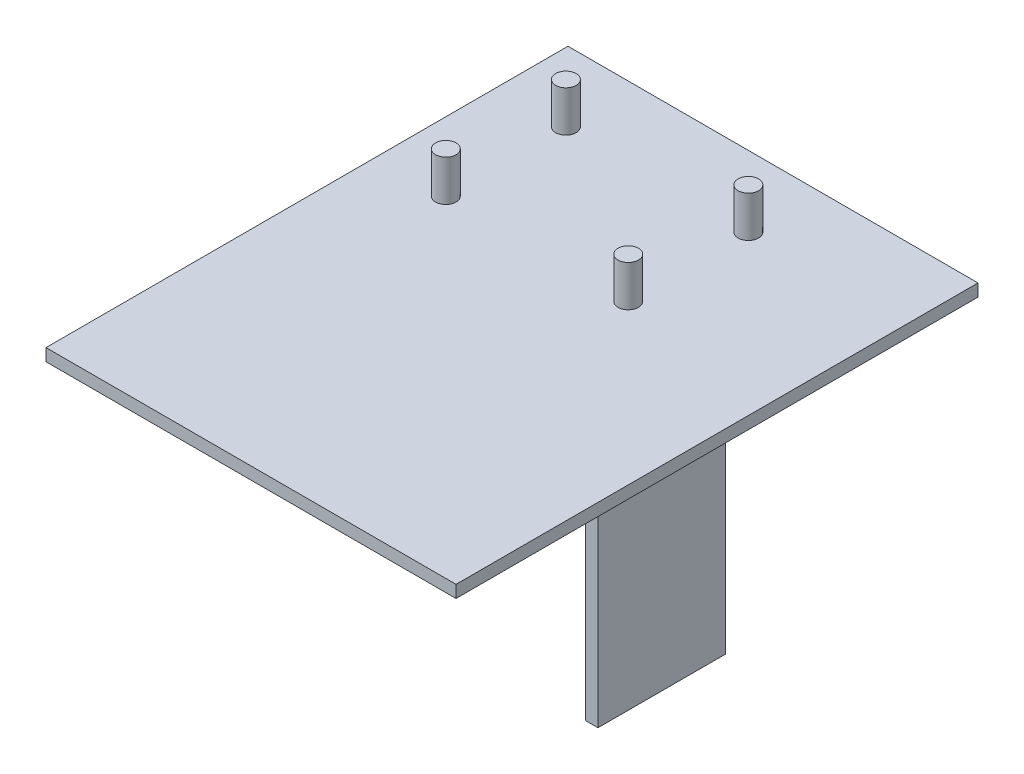
ISO-10303-21;
HEADER;
FILE_DESCRIPTION(('STEP AP214'),'2;1');
FILE_NAME('part.step','',(''),(''),'','','');
FILE_SCHEMA(('AUTOMOTIVE_DESIGN { 1 0 10303 214 1 1 1 1 }'));
ENDSEC;
DATA;
#1=APPLICATION_CONTEXT('core data for automotive mechanical design processes');
#2=APPLICATION_PROTOCOL_DEFINITION('international standard','automotive_design',2000,#1);
#3=PRODUCT_CONTEXT('',#1,'mechanical');
#4=PRODUCT('Part','Part','',(#3));
#5=PRODUCT_RELATED_PRODUCT_CATEGORY('part','',(#4));
#6=PRODUCT_DEFINITION_FORMATION('','',#4);
#7=PRODUCT_DEFINITION_CONTEXT('part definition',#1,'design');
#8=PRODUCT_DEFINITION('design','',#6,#7);
#9=PRODUCT_DEFINITION_SHAPE('','',#8);
#10=(LENGTH_UNIT() NAMED_UNIT(*) SI_UNIT(.MILLI.,.METRE.));
#11=(NAMED_UNIT(*) PLANE_ANGLE_UNIT() SI_UNIT($,.RADIAN.));
#12=(NAMED_UNIT(*) SI_UNIT($,.STERADIAN.) SOLID_ANGLE_UNIT());
#13=UNCERTAINTY_MEASURE_WITH_UNIT(LENGTH_MEASURE(1.E-05),#10,'distance_accuracy_value','');
#14=(GEOMETRIC_REPRESENTATION_CONTEXT(3) GLOBAL_UNCERTAINTY_ASSIGNED_CONTEXT((#13)) GLOBAL_UNIT_ASSIGNED_CONTEXT((#10,
#11,#12)) REPRESENTATION_CONTEXT('',''));
#15=CARTESIAN_POINT('',(0.,0.,0.));
#16=DIRECTION('',(0.,0.,1.));
#17=DIRECTION('',(1.,0.,0.));
#18=AXIS2_PLACEMENT_3D('',#15,#16,#17);
#19=CARTESIAN_POINT('',(0.,3.,0.));
#20=DIRECTION('',(0.,1.,0.));
#21=DIRECTION('',(0.,0.,1.));
#22=AXIS2_PLACEMENT_3D('',#19,#20,#21);
#23=PLANE('',#22);
#24=CARTESIAN_POINT('',(-33.2337453192935,3.,-17.0873669438549));
#25=DIRECTION('',(0.,1.,0.));
#26=DIRECTION('',(0.,0.,1.));
#27=AXIS2_PLACEMENT_3D('',#24,#25,#26);
#28=CIRCLE('',#27,2.5);
#29=CARTESIAN_POINT('',(-33.2337453192935,3.,-14.5873669438549));
#30=VERTEX_POINT('',#29);
#31=EDGE_CURVE('E243',#30,#30,#28,.T.);
#32=ORIENTED_EDGE('',*,*,#31,.F.);
#33=EDGE_LOOP('',(#32));
#34=FACE_BOUND('',#33,.T.);
#35=CARTESIAN_POINT('',(11.261315090124,3.,-46.3787356727323));
#36=DIRECTION('',(0.,1.,0.));
#37=DIRECTION('',(0.,0.,1.));
#38=AXIS2_PLACEMENT_3D('',#35,#36,#37);
#39=CIRCLE('',#38,2.5);
#40=CARTESIAN_POINT('',(11.261315090124,3.,-43.8787356727323));
#41=VERTEX_POINT('',#40);
#42=EDGE_CURVE('E258',#41,#41,#39,.T.);
#43=ORIENTED_EDGE('',*,*,#42,.F.);
#44=EDGE_LOOP('',(#43));
#45=FACE_BOUND('',#44,.T.);
#46=DIRECTION('',(0.,0.,-1.));
#47=VECTOR('',#46,1.);
#48=CARTESIAN_POINT('',(50.,3.,-63.6523764971984));
#49=LINE('',#48,#47);
#50=CARTESIAN_POINT('',(50.,3.,63.6523764971983));
#51=VERTEX_POINT('',#50);
#52=CARTESIAN_POINT('',(50.,3.,-63.6523764971984));
#53=VERTEX_POINT('',#52);
#54=EDGE_CURVE('E128',#51,#53,#49,.T.);
#55=ORIENTED_EDGE('',*,*,#54,.T.);
#56=DIRECTION('',(-1.,0.,0.));
#57=VECTOR('',#56,1.);
#58=CARTESIAN_POINT('',(-50.,3.,-63.6523764971984));
#59=LINE('',#58,#57);
#60=CARTESIAN_POINT('',(-50.,3.,-63.6523764971984));
#61=VERTEX_POINT('',#60);
#62=EDGE_CURVE('E131',#53,#61,#59,.T.);
#63=ORIENTED_EDGE('',*,*,#62,.T.);
#64=DIRECTION('',(0.,0.,1.));
#65=VECTOR('',#64,1.);
#66=CARTESIAN_POINT('',(-50.,3.,-63.6523764971984));
#67=LINE('',#66,#65);
#68=CARTESIAN_POINT('',(-50.,3.,63.6523764971983));
#69=VERTEX_POINT('',#68);
#70=EDGE_CURVE('E134',#61,#69,#67,.T.);
#71=ORIENTED_EDGE('',*,*,#70,.T.);
#72=DIRECTION('',(1.,0.,0.));
#73=VECTOR('',#72,1.);
#74=CARTESIAN_POINT('',(-50.,3.,63.6523764971983));
#75=LINE('',#74,#73);
#76=EDGE_CURVE('E136',#69,#51,#75,.T.);
#77=ORIENTED_EDGE('',*,*,#76,.T.);
#78=EDGE_LOOP('',(#55,#63,#71,#77));
#79=FACE_BOUND('',#78,.T.);
#80=CARTESIAN_POINT('',(11.261315090124,3.,-17.0873669438549));
#81=DIRECTION('',(0.,1.,0.));
#82=DIRECTION('',(0.,0.,1.));
#83=AXIS2_PLACEMENT_3D('',#80,#81,#82);
#84=CIRCLE('',#83,2.5);
#85=CARTESIAN_POINT('',(11.261315090124,3.,-14.5873669438549));
#86=VERTEX_POINT('',#85);
#87=EDGE_CURVE('E253',#86,#86,#84,.T.);
#88=ORIENTED_EDGE('',*,*,#87,.F.);
#89=EDGE_LOOP('',(#88));
#90=FACE_BOUND('',#89,.T.);
#91=CARTESIAN_POINT('',(-33.2337453192935,3.,-46.3787356727323));
#92=DIRECTION('',(0.,1.,0.));
#93=DIRECTION('',(0.,0.,1.));
#94=AXIS2_PLACEMENT_3D('',#91,#92,#93);
#95=CIRCLE('',#94,2.5);
#96=CARTESIAN_POINT('',(-33.2337453192935,3.,-43.8787356727323));
#97=VERTEX_POINT('',#96);
#98=EDGE_CURVE('E244',#97,#97,#95,.T.);
#99=ORIENTED_EDGE('',*,*,#98,.F.);
#100=EDGE_LOOP('',(#99));
#101=FACE_BOUND('',#100,.T.);
#102=ADVANCED_FACE('F33',(#34,#45,#79,#90,#101),#23,.T.);
#103=CARTESIAN_POINT('',(0.,0.,0.));
#104=DIRECTION('',(0.,1.,0.));
#105=DIRECTION('',(0.,0.,1.));
#106=AXIS2_PLACEMENT_3D('',#103,#104,#105);
#107=PLANE('',#106);
#108=DIRECTION('',(0.,0.,-1.));
#109=VECTOR('',#108,1.);
#110=CARTESIAN_POINT('',(50.,0.,-63.6523764971984));
#111=LINE('',#110,#109);
#112=CARTESIAN_POINT('',(50.,0.,63.6523764971983));
#113=VERTEX_POINT('',#112);
#114=CARTESIAN_POINT('',(50.,0.,-63.6523764971984));
#115=VERTEX_POINT('',#114);
#116=EDGE_CURVE('E119',#113,#115,#111,.T.);
#117=ORIENTED_EDGE('',*,*,#116,.F.);
#118=DIRECTION('',(1.,0.,0.));
#119=VECTOR('',#118,1.);
#120=CARTESIAN_POINT('',(-50.,0.,63.6523764971983));
#121=LINE('',#120,#119);
#122=CARTESIAN_POINT('',(-50.,0.,63.6523764971983));
#123=VERTEX_POINT('',#122);
#124=EDGE_CURVE('E132',#123,#113,#121,.T.);
#125=ORIENTED_EDGE('',*,*,#124,.F.);
#126=DIRECTION('',(0.,0.,1.));
#127=VECTOR('',#126,1.);
#128=CARTESIAN_POINT('',(-50.,0.,-63.6523764971984));
#129=LINE('',#128,#127);
#130=CARTESIAN_POINT('',(-50.,0.,-63.6523764971984));
#131=VERTEX_POINT('',#130);
#132=EDGE_CURVE('E140',#131,#123,#129,.T.);
#133=ORIENTED_EDGE('',*,*,#132,.F.);
#134=DIRECTION('',(-1.,0.,0.));
#135=VECTOR('',#134,1.);
#136=CARTESIAN_POINT('',(-50.,0.,-63.6523764971984));
#137=LINE('',#136,#135);
#138=EDGE_CURVE('E122',#115,#131,#137,.T.);
#139=ORIENTED_EDGE('',*,*,#138,.F.);
#140=EDGE_LOOP('',(#117,#125,#133,#139));
#141=FACE_BOUND('',#140,.T.);
#142=DIRECTION('',(0.,0.,1.));
#143=VECTOR('',#142,1.);
#144=CARTESIAN_POINT('',(34.6108399779155,0.,13.6473454260511));
#145=LINE('',#144,#143);
#146=CARTESIAN_POINT('',(34.6108399779155,0.,-17.4962251040256));
#147=VERTEX_POINT('',#146);
#148=CARTESIAN_POINT('',(34.6108399779155,0.,13.6473454260511));
#149=VERTEX_POINT('',#148);
#150=EDGE_CURVE('E118',#147,#149,#145,.T.);
#151=ORIENTED_EDGE('',*,*,#150,.F.);
#152=DIRECTION('',(1.,0.,0.));
#153=VECTOR('',#152,1.);
#154=CARTESIAN_POINT('',(34.6108399779155,0.,-17.4962251040256));
#155=LINE('',#154,#153);
#156=CARTESIAN_POINT('',(31.6108399779155,0.,-17.4962251040256));
#157=VERTEX_POINT('',#156);
#158=EDGE_CURVE('E115',#157,#147,#155,.T.);
#159=ORIENTED_EDGE('',*,*,#158,.F.);
#160=DIRECTION('',(0.,0.,-1.));
#161=VECTOR('',#160,1.);
#162=CARTESIAN_POINT('',(31.6108399779155,0.,13.6473454260511));
#163=LINE('',#162,#161);
#164=CARTESIAN_POINT('',(31.6108399779155,0.,13.6473454260511));
#165=VERTEX_POINT('',#164);
#166=EDGE_CURVE('E53',#165,#157,#163,.T.);
#167=ORIENTED_EDGE('',*,*,#166,.F.);
#168=DIRECTION('',(-1.,0.,0.));
#169=VECTOR('',#168,1.);
#170=CARTESIAN_POINT('',(34.6108399779155,0.,13.6473454260511));
#171=LINE('',#170,#169);
#172=EDGE_CURVE('E48',#149,#165,#171,.T.);
#173=ORIENTED_EDGE('',*,*,#172,.F.);
#174=EDGE_LOOP('',(#151,#159,#167,#173));
#175=FACE_BOUND('',#174,.T.);
#176=ADVANCED_FACE('F158',(#141,#175),#107,.F.);
#177=CARTESIAN_POINT('',(50.,3.,-63.6523764971984));
#178=DIRECTION('',(-1.,0.,0.));
#179=DIRECTION('',(0.,0.,1.));
#180=AXIS2_PLACEMENT_3D('',#177,#178,#179);
#181=PLANE('',#180);
#182=ORIENTED_EDGE('',*,*,#116,.T.);
#183=DIRECTION('',(0.,-1.,0.));
#184=VECTOR('',#183,1.);
#185=CARTESIAN_POINT('',(50.,3.,-63.6523764971984));
#186=LINE('',#185,#184);
#187=EDGE_CURVE('E11',#53,#115,#186,.T.);
#188=ORIENTED_EDGE('',*,*,#187,.F.);
#189=ORIENTED_EDGE('',*,*,#54,.F.);
#190=DIRECTION('',(0.,-1.,0.));
#191=VECTOR('',#190,1.);
#192=CARTESIAN_POINT('',(50.,3.,63.6523764971983));
#193=LINE('',#192,#191);
#194=EDGE_CURVE('E137',#51,#113,#193,.T.);
#195=ORIENTED_EDGE('',*,*,#194,.T.);
#196=EDGE_LOOP('',(#182,#188,#189,#195));
#197=FACE_BOUND('',#196,.T.);
#198=ADVANCED_FACE('F35',(#197),#181,.F.);
#199=CARTESIAN_POINT('',(-50.,3.,-63.6523764971984));
#200=DIRECTION('',(0.,0.,1.));
#201=DIRECTION('',(1.,0.,0.));
#202=AXIS2_PLACEMENT_3D('',#199,#200,#201);
#203=PLANE('',#202);
#204=ORIENTED_EDGE('',*,*,#138,.T.);
#205=DIRECTION('',(0.,-1.,0.));
#206=VECTOR('',#205,1.);
#207=CARTESIAN_POINT('',(-50.,3.,-63.6523764971984));
#208=LINE('',#207,#206);
#209=EDGE_CURVE('E41',#61,#131,#208,.T.);
#210=ORIENTED_EDGE('',*,*,#209,.F.);
#211=ORIENTED_EDGE('',*,*,#62,.F.);
#212=ORIENTED_EDGE('',*,*,#187,.T.);
#213=EDGE_LOOP('',(#204,#210,#211,#212));
#214=FACE_BOUND('',#213,.T.);
#215=ADVANCED_FACE('F168',(#214),#203,.F.);
#216=CARTESIAN_POINT('',(-50.,3.,-63.6523764971984));
#217=DIRECTION('',(1.,0.,0.));
#218=DIRECTION('',(0.,0.,-1.));
#219=AXIS2_PLACEMENT_3D('',#216,#217,#218);
#220=PLANE('',#219);
#221=ORIENTED_EDGE('',*,*,#132,.T.);
#222=DIRECTION('',(0.,-1.,0.));
#223=VECTOR('',#222,1.);
#224=CARTESIAN_POINT('',(-50.,3.,63.6523764971983));
#225=LINE('',#224,#223);
#226=EDGE_CURVE('E145',#69,#123,#225,.T.);
#227=ORIENTED_EDGE('',*,*,#226,.F.);
#228=ORIENTED_EDGE('',*,*,#70,.F.);
#229=ORIENTED_EDGE('',*,*,#209,.T.);
#230=EDGE_LOOP('',(#221,#227,#228,#229));
#231=FACE_BOUND('',#230,.T.);
#232=ADVANCED_FACE('F152',(#231),#220,.F.);
#233=CARTESIAN_POINT('',(-50.,3.,63.6523764971983));
#234=DIRECTION('',(0.,0.,-1.));
#235=DIRECTION('',(-1.,0.,0.));
#236=AXIS2_PLACEMENT_3D('',#233,#234,#235);
#237=PLANE('',#236);
#238=ORIENTED_EDGE('',*,*,#124,.T.);
#239=ORIENTED_EDGE('',*,*,#194,.F.);
#240=ORIENTED_EDGE('',*,*,#76,.F.);
#241=ORIENTED_EDGE('',*,*,#226,.T.);
#242=EDGE_LOOP('',(#238,#239,#240,#241));
#243=FACE_BOUND('',#242,.T.);
#244=ADVANCED_FACE('F161',(#243),#237,.F.);
#245=CARTESIAN_POINT('',(34.6108399779155,-60.,13.6473454260511));
#246=DIRECTION('',(-1.,0.,0.));
#247=DIRECTION('',(0.,0.,1.));
#248=AXIS2_PLACEMENT_3D('',#245,#246,#247);
#249=PLANE('',#248);
#250=ORIENTED_EDGE('',*,*,#150,.T.);
#251=DIRECTION('',(0.,1.,0.));
#252=VECTOR('',#251,1.);
#253=CARTESIAN_POINT('',(34.6108399779155,-60.,13.6473454260511));
#254=LINE('',#253,#252);
#255=CARTESIAN_POINT('',(34.6108399779155,-60.,13.6473454260511));
#256=VERTEX_POINT('',#255);
#257=EDGE_CURVE('E99',#256,#149,#254,.T.);
#258=ORIENTED_EDGE('',*,*,#257,.F.);
#259=DIRECTION('',(0.,0.,1.));
#260=VECTOR('',#259,1.);
#261=CARTESIAN_POINT('',(34.6108399779155,-60.,13.6473454260511));
#262=LINE('',#261,#260);
#263=CARTESIAN_POINT('',(34.6108399779155,-60.,-17.4962251040256));
#264=VERTEX_POINT('',#263);
#265=EDGE_CURVE('E106',#264,#256,#262,.T.);
#266=ORIENTED_EDGE('',*,*,#265,.F.);
#267=DIRECTION('',(0.,1.,0.));
#268=VECTOR('',#267,1.);
#269=CARTESIAN_POINT('',(34.6108399779155,-60.,-17.4962251040256));
#270=LINE('',#269,#268);
#271=EDGE_CURVE('E268',#264,#147,#270,.T.);
#272=ORIENTED_EDGE('',*,*,#271,.T.);
#273=EDGE_LOOP('',(#250,#258,#266,#272));
#274=FACE_BOUND('',#273,.T.);
#275=ADVANCED_FACE('F117',(#274),#249,.F.);
#276=CARTESIAN_POINT('',(34.6108399779155,-60.,13.6473454260511));
#277=DIRECTION('',(0.,0.,-1.));
#278=DIRECTION('',(-1.,0.,0.));
#279=AXIS2_PLACEMENT_3D('',#276,#277,#278);
#280=PLANE('',#279);
#281=ORIENTED_EDGE('',*,*,#172,.T.);
#282=DIRECTION('',(0.,1.,0.));
#283=VECTOR('',#282,1.);
#284=CARTESIAN_POINT('',(31.6108399779155,-60.,13.6473454260511));
#285=LINE('',#284,#283);
#286=CARTESIAN_POINT('',(31.6108399779155,-60.,13.6473454260511));
#287=VERTEX_POINT('',#286);
#288=EDGE_CURVE('E102',#287,#165,#285,.T.);
#289=ORIENTED_EDGE('',*,*,#288,.F.);
#290=DIRECTION('',(-1.,0.,0.));
#291=VECTOR('',#290,1.);
#292=CARTESIAN_POINT('',(34.6108399779155,-60.,13.6473454260511));
#293=LINE('',#292,#291);
#294=EDGE_CURVE('E95',#256,#287,#293,.T.);
#295=ORIENTED_EDGE('',*,*,#294,.F.);
#296=ORIENTED_EDGE('',*,*,#257,.T.);
#297=EDGE_LOOP('',(#281,#289,#295,#296));
#298=FACE_BOUND('',#297,.T.);
#299=ADVANCED_FACE('F97',(#298),#280,.F.);
#300=CARTESIAN_POINT('',(31.6108399779155,-60.,13.6473454260511));
#301=DIRECTION('',(1.,0.,0.));
#302=DIRECTION('',(0.,0.,-1.));
#303=AXIS2_PLACEMENT_3D('',#300,#301,#302);
#304=PLANE('',#303);
#305=ORIENTED_EDGE('',*,*,#166,.T.);
#306=DIRECTION('',(0.,1.,0.));
#307=VECTOR('',#306,1.);
#308=CARTESIAN_POINT('',(31.6108399779155,-60.,-17.4962251040256));
#309=LINE('',#308,#307);
#310=CARTESIAN_POINT('',(31.6108399779155,-60.,-17.4962251040256));
#311=VERTEX_POINT('',#310);
#312=EDGE_CURVE('E124',#311,#157,#309,.T.);
#313=ORIENTED_EDGE('',*,*,#312,.F.);
#314=DIRECTION('',(0.,0.,-1.));
#315=VECTOR('',#314,1.);
#316=CARTESIAN_POINT('',(31.6108399779155,-60.,13.6473454260511));
#317=LINE('',#316,#315);
#318=EDGE_CURVE('E105',#287,#311,#317,.T.);
#319=ORIENTED_EDGE('',*,*,#318,.F.);
#320=ORIENTED_EDGE('',*,*,#288,.T.);
#321=EDGE_LOOP('',(#305,#313,#319,#320));
#322=FACE_BOUND('',#321,.T.);
#323=ADVANCED_FACE('F194',(#322),#304,.F.);
#324=CARTESIAN_POINT('',(34.6108399779155,-60.,-17.4962251040256));
#325=DIRECTION('',(0.,0.,1.));
#326=DIRECTION('',(1.,0.,0.));
#327=AXIS2_PLACEMENT_3D('',#324,#325,#326);
#328=PLANE('',#327);
#329=ORIENTED_EDGE('',*,*,#158,.T.);
#330=ORIENTED_EDGE('',*,*,#271,.F.);
#331=DIRECTION('',(1.,0.,0.));
#332=VECTOR('',#331,1.);
#333=CARTESIAN_POINT('',(34.6108399779155,-60.,-17.4962251040256));
#334=LINE('',#333,#332);
#335=EDGE_CURVE('E111',#311,#264,#334,.T.);
#336=ORIENTED_EDGE('',*,*,#335,.F.);
#337=ORIENTED_EDGE('',*,*,#312,.T.);
#338=EDGE_LOOP('',(#329,#330,#336,#337));
#339=FACE_BOUND('',#338,.T.);
#340=ADVANCED_FACE('F198',(#339),#328,.F.);
#341=CARTESIAN_POINT('',(0.,-60.,0.));
#342=DIRECTION('',(0.,1.,0.));
#343=DIRECTION('',(0.,0.,1.));
#344=AXIS2_PLACEMENT_3D('',#341,#342,#343);
#345=PLANE('',#344);
#346=ORIENTED_EDGE('',*,*,#265,.T.);
#347=ORIENTED_EDGE('',*,*,#294,.T.);
#348=ORIENTED_EDGE('',*,*,#318,.T.);
#349=ORIENTED_EDGE('',*,*,#335,.T.);
#350=EDGE_LOOP('',(#346,#347,#348,#349));
#351=FACE_BOUND('',#350,.T.);
#352=ADVANCED_FACE('F109',(#351),#345,.F.);
#353=CARTESIAN_POINT('',(11.261315090124,13.,-46.3787356727323));
#354=DIRECTION('',(0.,-1.,0.));
#355=DIRECTION('',(0.,0.,-1.));
#356=AXIS2_PLACEMENT_3D('',#353,#354,#355);
#357=CYLINDRICAL_SURFACE('',#356,2.5);
#358=CARTESIAN_POINT('',(11.261315090124,13.,-46.3787356727323));
#359=DIRECTION('',(0.,1.,0.));
#360=DIRECTION('',(0.,0.,1.));
#361=AXIS2_PLACEMENT_3D('',#358,#359,#360);
#362=CIRCLE('',#361,2.5);
#363=CARTESIAN_POINT('',(11.261315090124,13.,-43.8787356727323));
#364=VERTEX_POINT('',#363);
#365=EDGE_CURVE('E261',#364,#364,#362,.T.);
#366=ORIENTED_EDGE('',*,*,#365,.F.);
#367=EDGE_LOOP('',(#366));
#368=FACE_BOUND('',#367,.T.);
#369=ORIENTED_EDGE('',*,*,#42,.T.);
#370=EDGE_LOOP('',(#369));
#371=FACE_BOUND('',#370,.T.);
#372=ADVANCED_FACE('F207',(#368,#371),#357,.T.);
#373=CARTESIAN_POINT('',(11.261315090124,13.,-46.3787356727323));
#374=DIRECTION('',(0.,1.,0.));
#375=DIRECTION('',(0.,0.,1.));
#376=AXIS2_PLACEMENT_3D('',#373,#374,#375);
#377=PLANE('',#376);
#378=ORIENTED_EDGE('',*,*,#365,.T.);
#379=EDGE_LOOP('',(#378));
#380=FACE_BOUND('',#379,.T.);
#381=ADVANCED_FACE('F210',(#380),#377,.T.);
#382=CARTESIAN_POINT('',(11.261315090124,13.,-17.0873669438549));
#383=DIRECTION('',(0.,-1.,0.));
#384=DIRECTION('',(0.,0.,-1.));
#385=AXIS2_PLACEMENT_3D('',#382,#383,#384);
#386=CYLINDRICAL_SURFACE('',#385,2.5);
#387=CARTESIAN_POINT('',(11.261315090124,13.,-17.0873669438549));
#388=DIRECTION('',(0.,1.,0.));
#389=DIRECTION('',(0.,0.,1.));
#390=AXIS2_PLACEMENT_3D('',#387,#388,#389);
#391=CIRCLE('',#390,2.5);
#392=CARTESIAN_POINT('',(11.261315090124,13.,-14.5873669438549));
#393=VERTEX_POINT('',#392);
#394=EDGE_CURVE('E255',#393,#393,#391,.T.);
#395=ORIENTED_EDGE('',*,*,#394,.F.);
#396=EDGE_LOOP('',(#395));
#397=FACE_BOUND('',#396,.T.);
#398=ORIENTED_EDGE('',*,*,#87,.T.);
#399=EDGE_LOOP('',(#398));
#400=FACE_BOUND('',#399,.T.);
#401=ADVANCED_FACE('F214',(#397,#400),#386,.T.);
#402=CARTESIAN_POINT('',(11.261315090124,13.,-17.0873669438549));
#403=DIRECTION('',(0.,1.,0.));
#404=DIRECTION('',(0.,0.,1.));
#405=AXIS2_PLACEMENT_3D('',#402,#403,#404);
#406=PLANE('',#405);
#407=ORIENTED_EDGE('',*,*,#394,.T.);
#408=EDGE_LOOP('',(#407));
#409=FACE_BOUND('',#408,.T.);
#410=ADVANCED_FACE('F218',(#409),#406,.T.);
#411=CARTESIAN_POINT('',(-33.2337453192935,13.,-17.0873669438549));
#412=DIRECTION('',(0.,-1.,0.));
#413=DIRECTION('',(0.,0.,-1.));
#414=AXIS2_PLACEMENT_3D('',#411,#412,#413);
#415=CYLINDRICAL_SURFACE('',#414,2.5);
#416=CARTESIAN_POINT('',(-33.2337453192935,13.,-17.0873669438549));
#417=DIRECTION('',(0.,1.,0.));
#418=DIRECTION('',(0.,0.,1.));
#419=AXIS2_PLACEMENT_3D('',#416,#417,#418);
#420=CIRCLE('',#419,2.5);
#421=CARTESIAN_POINT('',(-33.2337453192935,13.,-14.5873669438549));
#422=VERTEX_POINT('',#421);
#423=EDGE_CURVE('E247',#422,#422,#420,.T.);
#424=ORIENTED_EDGE('',*,*,#423,.F.);
#425=EDGE_LOOP('',(#424));
#426=FACE_BOUND('',#425,.T.);
#427=ORIENTED_EDGE('',*,*,#31,.T.);
#428=EDGE_LOOP('',(#427));
#429=FACE_BOUND('',#428,.T.);
#430=ADVANCED_FACE('F222',(#426,#429),#415,.T.);
#431=CARTESIAN_POINT('',(-33.2337453192935,13.,-17.0873669438549));
#432=DIRECTION('',(0.,1.,0.));
#433=DIRECTION('',(0.,0.,1.));
#434=AXIS2_PLACEMENT_3D('',#431,#432,#433);
#435=PLANE('',#434);
#436=ORIENTED_EDGE('',*,*,#423,.T.);
#437=EDGE_LOOP('',(#436));
#438=FACE_BOUND('',#437,.T.);
#439=ADVANCED_FACE('F226',(#438),#435,.T.);
#440=CARTESIAN_POINT('',(-33.2337453192935,13.,-46.3787356727323));
#441=DIRECTION('',(0.,-1.,0.));
#442=DIRECTION('',(0.,0.,-1.));
#443=AXIS2_PLACEMENT_3D('',#440,#441,#442);
#444=CYLINDRICAL_SURFACE('',#443,2.5);
#445=CARTESIAN_POINT('',(-33.2337453192935,13.,-46.3787356727323));
#446=DIRECTION('',(0.,1.,0.));
#447=DIRECTION('',(0.,0.,1.));
#448=AXIS2_PLACEMENT_3D('',#445,#446,#447);
#449=CIRCLE('',#448,2.5);
#450=CARTESIAN_POINT('',(-33.2337453192935,13.,-43.8787356727323));
#451=VERTEX_POINT('',#450);
#452=EDGE_CURVE('E242',#451,#451,#449,.T.);
#453=ORIENTED_EDGE('',*,*,#452,.F.);
#454=EDGE_LOOP('',(#453));
#455=FACE_BOUND('',#454,.T.);
#456=ORIENTED_EDGE('',*,*,#98,.T.);
#457=EDGE_LOOP('',(#456));
#458=FACE_BOUND('',#457,.T.);
#459=ADVANCED_FACE('F230',(#455,#458),#444,.T.);
#460=CARTESIAN_POINT('',(-33.2337453192935,13.,-46.3787356727323));
#461=DIRECTION('',(0.,1.,0.));
#462=DIRECTION('',(0.,0.,1.));
#463=AXIS2_PLACEMENT_3D('',#460,#461,#462);
#464=PLANE('',#463);
#465=ORIENTED_EDGE('',*,*,#452,.T.);
#466=EDGE_LOOP('',(#465));
#467=FACE_BOUND('',#466,.T.);
#468=ADVANCED_FACE('F234',(#467),#464,.T.);
#469=CLOSED_SHELL('',(#102,#176,#198,#215,#232,#244,#275,#299,#323,#340,#352,#372,#381,#401,
#410,#430,#439,#459,#468));
#470=MANIFOLD_SOLID_BREP('B2',#469);
#471=ADVANCED_BREP_SHAPE_REPRESENTATION('',(#18,#470),#14);
#472=SHAPE_DEFINITION_REPRESENTATION(#9,#471);
ENDSEC;
END-ISO-10303-21;
